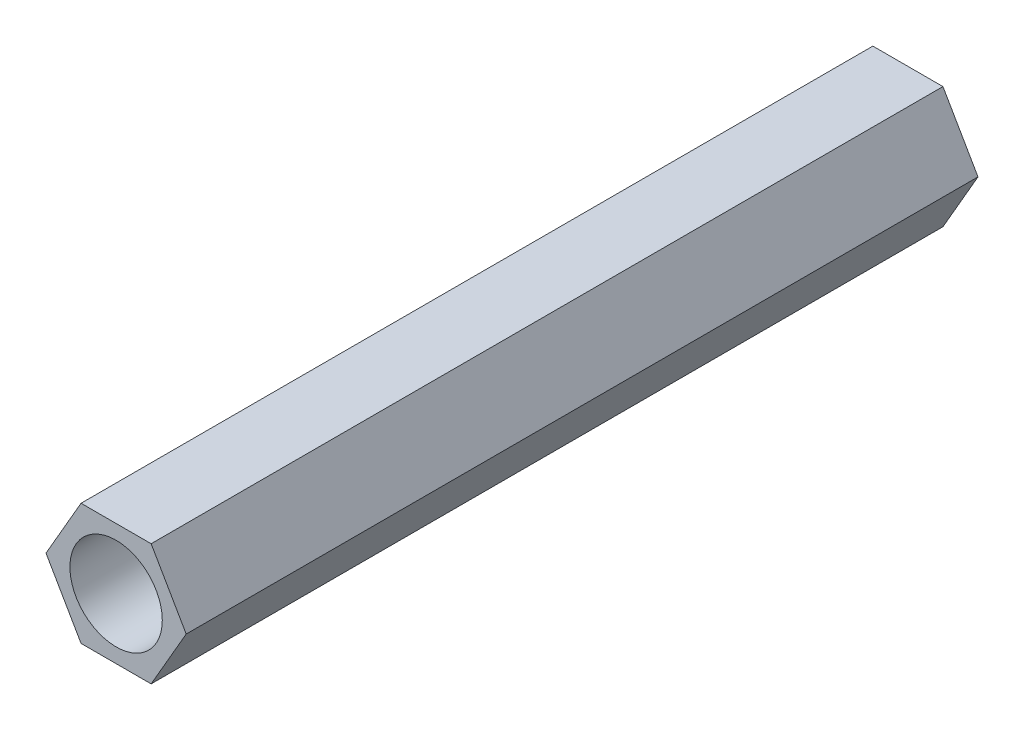
ISO-10303-21;
HEADER;
FILE_DESCRIPTION(('STEP AP214'),'2;1');
FILE_NAME('part.step','',(''),(''),'','','');
FILE_SCHEMA(('AUTOMOTIVE_DESIGN { 1 0 10303 214 1 1 1 1 }'));
ENDSEC;
DATA;
#1=APPLICATION_CONTEXT('core data for automotive mechanical design processes');
#2=APPLICATION_PROTOCOL_DEFINITION('international standard','automotive_design',2000,#1);
#3=PRODUCT_CONTEXT('',#1,'mechanical');
#4=PRODUCT('Part','Part','',(#3));
#5=PRODUCT_RELATED_PRODUCT_CATEGORY('part','',(#4));
#6=PRODUCT_DEFINITION_FORMATION('','',#4);
#7=PRODUCT_DEFINITION_CONTEXT('part definition',#1,'design');
#8=PRODUCT_DEFINITION('design','',#6,#7);
#9=PRODUCT_DEFINITION_SHAPE('','',#8);
#10=(LENGTH_UNIT() NAMED_UNIT(*) SI_UNIT(.MILLI.,.METRE.));
#11=(NAMED_UNIT(*) PLANE_ANGLE_UNIT() SI_UNIT($,.RADIAN.));
#12=(NAMED_UNIT(*) SI_UNIT($,.STERADIAN.) SOLID_ANGLE_UNIT());
#13=UNCERTAINTY_MEASURE_WITH_UNIT(LENGTH_MEASURE(1.E-05),#10,'distance_accuracy_value','');
#14=(GEOMETRIC_REPRESENTATION_CONTEXT(3) GLOBAL_UNCERTAINTY_ASSIGNED_CONTEXT((#13)) GLOBAL_UNIT_ASSIGNED_CONTEXT((#10,
#11,#12)) REPRESENTATION_CONTEXT('',''));
#15=CARTESIAN_POINT('',(0.,0.,0.));
#16=DIRECTION('',(0.,0.,1.));
#17=DIRECTION('',(1.,0.,0.));
#18=AXIS2_PLACEMENT_3D('',#15,#16,#17);
#19=CARTESIAN_POINT('',(1.32790561913614,-2.3,30.));
#20=DIRECTION('',(-0.866025403784439,0.499999999999999,0.));
#21=DIRECTION('',(-0.499999999999999,-0.866025403784439,0.));
#22=AXIS2_PLACEMENT_3D('',#19,#20,#21);
#23=PLANE('',#22);
#24=DIRECTION('',(0.499999999999999,0.866025403784439,0.));
#25=VECTOR('',#24,1.);
#26=CARTESIAN_POINT('',(1.32790561913614,-2.3,0.));
#27=LINE('',#26,#25);
#28=CARTESIAN_POINT('',(1.32790561913614,-2.3,0.));
#29=VERTEX_POINT('',#28);
#30=CARTESIAN_POINT('',(2.65581123827228,0.,0.));
#31=VERTEX_POINT('',#30);
#32=EDGE_CURVE('E117',#29,#31,#27,.T.);
#33=ORIENTED_EDGE('',*,*,#32,.T.);
#34=DIRECTION('',(0.,0.,-1.));
#35=VECTOR('',#34,1.);
#36=CARTESIAN_POINT('',(2.65581123827228,0.,30.));
#37=LINE('',#36,#35);
#38=CARTESIAN_POINT('',(2.65581123827228,0.,30.));
#39=VERTEX_POINT('',#38);
#40=EDGE_CURVE('E11',#39,#31,#37,.T.);
#41=ORIENTED_EDGE('',*,*,#40,.F.);
#42=DIRECTION('',(0.499999999999999,0.866025403784439,0.));
#43=VECTOR('',#42,1.);
#44=CARTESIAN_POINT('',(1.32790561913614,-2.3,30.));
#45=LINE('',#44,#43);
#46=CARTESIAN_POINT('',(1.32790561913614,-2.3,30.));
#47=VERTEX_POINT('',#46);
#48=EDGE_CURVE('E128',#47,#39,#45,.T.);
#49=ORIENTED_EDGE('',*,*,#48,.F.);
#50=DIRECTION('',(0.,0.,-1.));
#51=VECTOR('',#50,1.);
#52=CARTESIAN_POINT('',(1.32790561913614,-2.3,30.));
#53=LINE('',#52,#51);
#54=EDGE_CURVE('E113',#47,#29,#53,.T.);
#55=ORIENTED_EDGE('',*,*,#54,.T.);
#56=EDGE_LOOP('',(#33,#41,#49,#55));
#57=FACE_BOUND('',#56,.T.);
#58=ADVANCED_FACE('F33',(#57),#23,.F.);
#59=CARTESIAN_POINT('',(2.65581123827228,0.,30.));
#60=DIRECTION('',(-0.866025403784438,-0.5,0.));
#61=DIRECTION('',(0.5,-0.866025403784439,0.));
#62=AXIS2_PLACEMENT_3D('',#59,#60,#61);
#63=PLANE('',#62);
#64=DIRECTION('',(-0.5,0.866025403784439,0.));
#65=VECTOR('',#64,1.);
#66=CARTESIAN_POINT('',(2.65581123827228,0.,0.));
#67=LINE('',#66,#65);
#68=CARTESIAN_POINT('',(1.32790561913614,2.3,0.));
#69=VERTEX_POINT('',#68);
#70=EDGE_CURVE('E120',#31,#69,#67,.T.);
#71=ORIENTED_EDGE('',*,*,#70,.T.);
#72=DIRECTION('',(0.,0.,-1.));
#73=VECTOR('',#72,1.);
#74=CARTESIAN_POINT('',(1.32790561913614,2.3,30.));
#75=LINE('',#74,#73);
#76=CARTESIAN_POINT('',(1.32790561913614,2.3,30.));
#77=VERTEX_POINT('',#76);
#78=EDGE_CURVE('E41',#77,#69,#75,.T.);
#79=ORIENTED_EDGE('',*,*,#78,.F.);
#80=DIRECTION('',(-0.5,0.866025403784439,0.));
#81=VECTOR('',#80,1.);
#82=CARTESIAN_POINT('',(2.65581123827228,0.,30.));
#83=LINE('',#82,#81);
#84=EDGE_CURVE('E86',#39,#77,#83,.T.);
#85=ORIENTED_EDGE('',*,*,#84,.F.);
#86=ORIENTED_EDGE('',*,*,#40,.T.);
#87=EDGE_LOOP('',(#71,#79,#85,#86));
#88=FACE_BOUND('',#87,.T.);
#89=ADVANCED_FACE('F153',(#88),#63,.F.);
#90=CARTESIAN_POINT('',(1.32790561913614,2.3,30.));
#91=DIRECTION('',(0.,-1.,0.));
#92=DIRECTION('',(1.,0.,0.));
#93=AXIS2_PLACEMENT_3D('',#90,#91,#92);
#94=PLANE('',#93);
#95=DIRECTION('',(-1.,0.,0.));
#96=VECTOR('',#95,1.);
#97=CARTESIAN_POINT('',(1.32790561913614,2.3,0.));
#98=LINE('',#97,#96);
#99=CARTESIAN_POINT('',(-1.32790561913614,2.3,0.));
#100=VERTEX_POINT('',#99);
#101=EDGE_CURVE('E123',#69,#100,#98,.T.);
#102=ORIENTED_EDGE('',*,*,#101,.T.);
#103=DIRECTION('',(0.,0.,-1.));
#104=VECTOR('',#103,1.);
#105=CARTESIAN_POINT('',(-1.32790561913614,2.3,30.));
#106=LINE('',#105,#104);
#107=CARTESIAN_POINT('',(-1.32790561913614,2.3,30.));
#108=VERTEX_POINT('',#107);
#109=EDGE_CURVE('E108',#108,#100,#106,.T.);
#110=ORIENTED_EDGE('',*,*,#109,.F.);
#111=DIRECTION('',(-1.,0.,0.));
#112=VECTOR('',#111,1.);
#113=CARTESIAN_POINT('',(1.32790561913614,2.3,30.));
#114=LINE('',#113,#112);
#115=EDGE_CURVE('E99',#77,#108,#114,.T.);
#116=ORIENTED_EDGE('',*,*,#115,.F.);
#117=ORIENTED_EDGE('',*,*,#78,.T.);
#118=EDGE_LOOP('',(#102,#110,#116,#117));
#119=FACE_BOUND('',#118,.T.);
#120=ADVANCED_FACE('F134',(#119),#94,.F.);
#121=CARTESIAN_POINT('',(-1.32790561913614,2.3,30.));
#122=DIRECTION('',(0.866025403784439,-0.5,0.));
#123=DIRECTION('',(0.5,0.866025403784439,0.));
#124=AXIS2_PLACEMENT_3D('',#121,#122,#123);
#125=PLANE('',#124);
#126=DIRECTION('',(-0.5,-0.866025403784439,0.));
#127=VECTOR('',#126,1.);
#128=CARTESIAN_POINT('',(-1.32790561913614,2.3,0.));
#129=LINE('',#128,#127);
#130=CARTESIAN_POINT('',(-2.65581123827228,0.,0.));
#131=VERTEX_POINT('',#130);
#132=EDGE_CURVE('E107',#100,#131,#129,.T.);
#133=ORIENTED_EDGE('',*,*,#132,.T.);
#134=DIRECTION('',(0.,0.,-1.));
#135=VECTOR('',#134,1.);
#136=CARTESIAN_POINT('',(-2.65581123827228,0.,30.));
#137=LINE('',#136,#135);
#138=CARTESIAN_POINT('',(-2.65581123827228,0.,30.));
#139=VERTEX_POINT('',#138);
#140=EDGE_CURVE('E104',#139,#131,#137,.T.);
#141=ORIENTED_EDGE('',*,*,#140,.F.);
#142=DIRECTION('',(-0.5,-0.866025403784439,0.));
#143=VECTOR('',#142,1.);
#144=CARTESIAN_POINT('',(-1.32790561913614,2.3,30.));
#145=LINE('',#144,#143);
#146=EDGE_CURVE('E93',#108,#139,#145,.T.);
#147=ORIENTED_EDGE('',*,*,#146,.F.);
#148=ORIENTED_EDGE('',*,*,#109,.T.);
#149=EDGE_LOOP('',(#133,#141,#147,#148));
#150=FACE_BOUND('',#149,.T.);
#151=ADVANCED_FACE('F105',(#150),#125,.F.);
#152=CARTESIAN_POINT('',(-2.65581123827228,0.,30.));
#153=DIRECTION('',(0.866025403784438,0.5,0.));
#154=DIRECTION('',(-0.5,0.866025403784438,0.));
#155=AXIS2_PLACEMENT_3D('',#152,#153,#154);
#156=PLANE('',#155);
#157=DIRECTION('',(0.5,-0.866025403784438,0.));
#158=VECTOR('',#157,1.);
#159=CARTESIAN_POINT('',(-2.65581123827228,0.,0.));
#160=LINE('',#159,#158);
#161=CARTESIAN_POINT('',(-1.32790561913614,-2.3,0.));
#162=VERTEX_POINT('',#161);
#163=EDGE_CURVE('E72',#131,#162,#160,.T.);
#164=ORIENTED_EDGE('',*,*,#163,.T.);
#165=DIRECTION('',(0.,0.,-1.));
#166=VECTOR('',#165,1.);
#167=CARTESIAN_POINT('',(-1.32790561913614,-2.3,30.));
#168=LINE('',#167,#166);
#169=CARTESIAN_POINT('',(-1.32790561913614,-2.3,30.));
#170=VERTEX_POINT('',#169);
#171=EDGE_CURVE('E109',#170,#162,#168,.T.);
#172=ORIENTED_EDGE('',*,*,#171,.F.);
#173=DIRECTION('',(0.5,-0.866025403784438,0.));
#174=VECTOR('',#173,1.);
#175=CARTESIAN_POINT('',(-2.65581123827228,0.,30.));
#176=LINE('',#175,#174);
#177=EDGE_CURVE('E97',#139,#170,#176,.T.);
#178=ORIENTED_EDGE('',*,*,#177,.F.);
#179=ORIENTED_EDGE('',*,*,#140,.T.);
#180=EDGE_LOOP('',(#164,#172,#178,#179));
#181=FACE_BOUND('',#180,.T.);
#182=ADVANCED_FACE('F111',(#181),#156,.F.);
#183=CARTESIAN_POINT('',(-1.32790561913614,-2.3,30.));
#184=DIRECTION('',(0.,1.,0.));
#185=DIRECTION('',(-1.,0.,0.));
#186=AXIS2_PLACEMENT_3D('',#183,#184,#185);
#187=PLANE('',#186);
#188=DIRECTION('',(1.,0.,0.));
#189=VECTOR('',#188,1.);
#190=CARTESIAN_POINT('',(-1.32790561913614,-2.3,0.));
#191=LINE('',#190,#189);
#192=EDGE_CURVE('E78',#162,#29,#191,.T.);
#193=ORIENTED_EDGE('',*,*,#192,.T.);
#194=ORIENTED_EDGE('',*,*,#54,.F.);
#195=DIRECTION('',(1.,0.,0.));
#196=VECTOR('',#195,1.);
#197=CARTESIAN_POINT('',(-1.32790561913614,-2.3,30.));
#198=LINE('',#197,#196);
#199=EDGE_CURVE('E49',#170,#47,#198,.T.);
#200=ORIENTED_EDGE('',*,*,#199,.F.);
#201=ORIENTED_EDGE('',*,*,#171,.T.);
#202=EDGE_LOOP('',(#193,#194,#200,#201));
#203=FACE_BOUND('',#202,.T.);
#204=ADVANCED_FACE('F141',(#203),#187,.F.);
#205=CARTESIAN_POINT('',(0.,0.,30.));
#206=DIRECTION('',(0.,0.,1.));
#207=DIRECTION('',(1.,0.,0.));
#208=AXIS2_PLACEMENT_3D('',#205,#206,#207);
#209=PLANE('',#208);
#210=CARTESIAN_POINT('',(0.,0.,30.));
#211=DIRECTION('',(0.,0.,1.));
#212=DIRECTION('',(1.,0.,0.));
#213=AXIS2_PLACEMENT_3D('',#210,#211,#212);
#214=CIRCLE('',#213,1.75);
#215=CARTESIAN_POINT('',(1.75,0.,30.));
#216=VERTEX_POINT('',#215);
#217=EDGE_CURVE('E208',#216,#216,#214,.T.);
#218=ORIENTED_EDGE('',*,*,#217,.F.);
#219=EDGE_LOOP('',(#218));
#220=FACE_BOUND('',#219,.T.);
#221=ORIENTED_EDGE('',*,*,#48,.T.);
#222=ORIENTED_EDGE('',*,*,#84,.T.);
#223=ORIENTED_EDGE('',*,*,#115,.T.);
#224=ORIENTED_EDGE('',*,*,#146,.T.);
#225=ORIENTED_EDGE('',*,*,#177,.T.);
#226=ORIENTED_EDGE('',*,*,#199,.T.);
#227=EDGE_LOOP('',(#221,#222,#223,#224,#225,#226));
#228=FACE_BOUND('',#227,.T.);
#229=ADVANCED_FACE('F95',(#220,#228),#209,.T.);
#230=CARTESIAN_POINT('',(0.,0.,0.));
#231=DIRECTION('',(0.,0.,1.));
#232=DIRECTION('',(1.,0.,0.));
#233=AXIS2_PLACEMENT_3D('',#230,#231,#232);
#234=PLANE('',#233);
#235=CARTESIAN_POINT('',(0.,0.,0.));
#236=DIRECTION('',(0.,0.,1.));
#237=DIRECTION('',(1.,0.,0.));
#238=AXIS2_PLACEMENT_3D('',#235,#236,#237);
#239=CIRCLE('',#238,1.75);
#240=CARTESIAN_POINT('',(1.75,0.,0.));
#241=VERTEX_POINT('',#240);
#242=EDGE_CURVE('E121',#241,#241,#239,.T.);
#243=ORIENTED_EDGE('',*,*,#242,.T.);
#244=EDGE_LOOP('',(#243));
#245=FACE_BOUND('',#244,.T.);
#246=ORIENTED_EDGE('',*,*,#32,.F.);
#247=ORIENTED_EDGE('',*,*,#192,.F.);
#248=ORIENTED_EDGE('',*,*,#163,.F.);
#249=ORIENTED_EDGE('',*,*,#132,.F.);
#250=ORIENTED_EDGE('',*,*,#101,.F.);
#251=ORIENTED_EDGE('',*,*,#70,.F.);
#252=EDGE_LOOP('',(#246,#247,#248,#249,#250,#251));
#253=FACE_BOUND('',#252,.T.);
#254=ADVANCED_FACE('F137',(#245,#253),#234,.F.);
#255=CARTESIAN_POINT('',(0.,0.,0.));
#256=DIRECTION('',(0.,0.,1.));
#257=DIRECTION('',(1.,0.,0.));
#258=AXIS2_PLACEMENT_3D('',#255,#256,#257);
#259=CYLINDRICAL_SURFACE('',#258,1.75);
#260=ORIENTED_EDGE('',*,*,#242,.F.);
#261=EDGE_LOOP('',(#260));
#262=FACE_BOUND('',#261,.T.);
#263=ORIENTED_EDGE('',*,*,#217,.T.);
#264=EDGE_LOOP('',(#263));
#265=FACE_BOUND('',#264,.T.);
#266=ADVANCED_FACE('F190',(#262,#265),#259,.F.);
#267=CLOSED_SHELL('',(#58,#89,#120,#151,#182,#204,#229,#254,#266));
#268=MANIFOLD_SOLID_BREP('B2',#267);
#269=ADVANCED_BREP_SHAPE_REPRESENTATION('',(#18,#268),#14);
#270=SHAPE_DEFINITION_REPRESENTATION(#9,#269);
ENDSEC;
END-ISO-10303-21;
